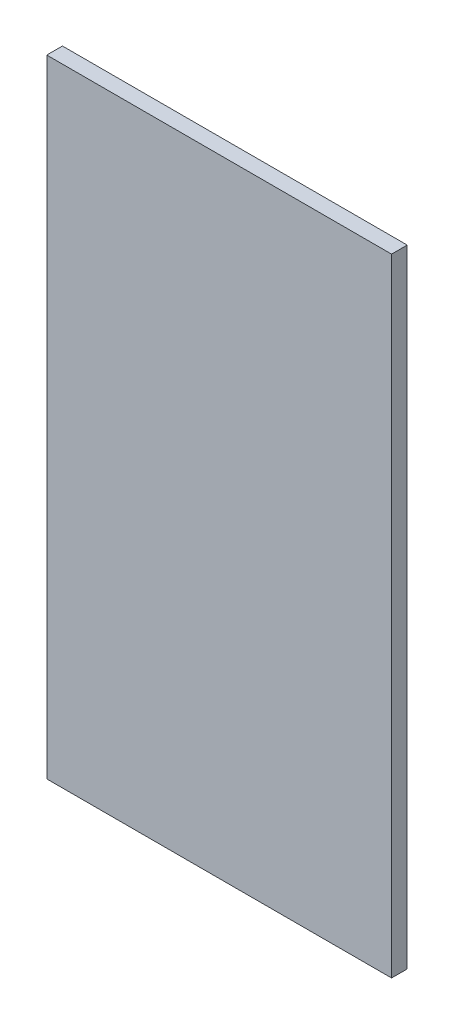
ISO-10303-21;
HEADER;
FILE_DESCRIPTION(('STEP AP214'),'2;1');
FILE_NAME('part.step','',(''),(''),'','','');
FILE_SCHEMA(('AUTOMOTIVE_DESIGN { 1 0 10303 214 1 1 1 1 }'));
ENDSEC;
DATA;
#1=APPLICATION_CONTEXT('core data for automotive mechanical design processes');
#2=APPLICATION_PROTOCOL_DEFINITION('international standard','automotive_design',2000,#1);
#3=PRODUCT_CONTEXT('',#1,'mechanical');
#4=PRODUCT('Part','Part','',(#3));
#5=PRODUCT_RELATED_PRODUCT_CATEGORY('part','',(#4));
#6=PRODUCT_DEFINITION_FORMATION('','',#4);
#7=PRODUCT_DEFINITION_CONTEXT('part definition',#1,'design');
#8=PRODUCT_DEFINITION('design','',#6,#7);
#9=PRODUCT_DEFINITION_SHAPE('','',#8);
#10=(LENGTH_UNIT() NAMED_UNIT(*) SI_UNIT(.MILLI.,.METRE.));
#11=(NAMED_UNIT(*) PLANE_ANGLE_UNIT() SI_UNIT($,.RADIAN.));
#12=(NAMED_UNIT(*) SI_UNIT($,.STERADIAN.) SOLID_ANGLE_UNIT());
#13=UNCERTAINTY_MEASURE_WITH_UNIT(LENGTH_MEASURE(1.E-05),#10,'distance_accuracy_value','');
#14=(GEOMETRIC_REPRESENTATION_CONTEXT(3) GLOBAL_UNCERTAINTY_ASSIGNED_CONTEXT((#13)) GLOBAL_UNIT_ASSIGNED_CONTEXT((#10,
#11,#12)) REPRESENTATION_CONTEXT('',''));
#15=CARTESIAN_POINT('',(0.,0.,0.));
#16=DIRECTION('',(0.,0.,1.));
#17=DIRECTION('',(1.,0.,0.));
#18=AXIS2_PLACEMENT_3D('',#15,#16,#17);
#19=CARTESIAN_POINT('',(314.324999999999,-12.6999999999998,6.35));
#20=DIRECTION('',(1.,0.,0.));
#21=DIRECTION('',(0.,0.,-1.));
#22=AXIS2_PLACEMENT_3D('',#19,#20,#21);
#23=PLANE('',#22);
#24=DIRECTION('',(0.,-1.,0.));
#25=VECTOR('',#24,1.);
#26=CARTESIAN_POINT('',(314.324999999999,-12.6999999999998,0.));
#27=LINE('',#26,#25);
#28=CARTESIAN_POINT('',(314.324999999999,241.3,0.));
#29=VERTEX_POINT('',#28);
#30=CARTESIAN_POINT('',(314.324999999999,-12.6999999999998,0.));
#31=VERTEX_POINT('',#30);
#32=EDGE_CURVE('E100',#29,#31,#27,.T.);
#33=ORIENTED_EDGE('',*,*,#32,.T.);
#34=DIRECTION('',(0.,0.,-1.));
#35=VECTOR('',#34,1.);
#36=CARTESIAN_POINT('',(314.324999999999,-12.6999999999998,6.35));
#37=LINE('',#36,#35);
#38=CARTESIAN_POINT('',(314.324999999999,-12.6999999999998,6.35));
#39=VERTEX_POINT('',#38);
#40=EDGE_CURVE('E11',#39,#31,#37,.T.);
#41=ORIENTED_EDGE('',*,*,#40,.F.);
#42=DIRECTION('',(0.,-1.,0.));
#43=VECTOR('',#42,1.);
#44=CARTESIAN_POINT('',(314.324999999999,-12.6999999999998,6.35));
#45=LINE('',#44,#43);
#46=CARTESIAN_POINT('',(314.324999999999,241.3,6.35));
#47=VERTEX_POINT('',#46);
#48=EDGE_CURVE('E88',#47,#39,#45,.T.);
#49=ORIENTED_EDGE('',*,*,#48,.F.);
#50=DIRECTION('',(0.,0.,-1.));
#51=VECTOR('',#50,1.);
#52=CARTESIAN_POINT('',(314.324999999999,241.3,6.35));
#53=LINE('',#52,#51);
#54=EDGE_CURVE('E96',#47,#29,#53,.T.);
#55=ORIENTED_EDGE('',*,*,#54,.T.);
#56=EDGE_LOOP('',(#33,#41,#49,#55));
#57=FACE_BOUND('',#56,.T.);
#58=ADVANCED_FACE('F37',(#57),#23,.F.);
#59=CARTESIAN_POINT('',(454.025,-12.6999999999998,6.35));
#60=DIRECTION('',(0.,1.,0.));
#61=DIRECTION('',(0.,0.,1.));
#62=AXIS2_PLACEMENT_3D('',#59,#60,#61);
#63=PLANE('',#62);
#64=DIRECTION('',(1.,0.,0.));
#65=VECTOR('',#64,1.);
#66=CARTESIAN_POINT('',(454.025,-12.6999999999998,0.));
#67=LINE('',#66,#65);
#68=CARTESIAN_POINT('',(454.025,-12.6999999999998,0.));
#69=VERTEX_POINT('',#68);
#70=EDGE_CURVE('E92',#31,#69,#67,.T.);
#71=ORIENTED_EDGE('',*,*,#70,.T.);
#72=DIRECTION('',(0.,0.,-1.));
#73=VECTOR('',#72,1.);
#74=CARTESIAN_POINT('',(454.025,-12.6999999999998,6.35));
#75=LINE('',#74,#73);
#76=CARTESIAN_POINT('',(454.025,-12.6999999999998,6.35));
#77=VERTEX_POINT('',#76);
#78=EDGE_CURVE('E45',#77,#69,#75,.T.);
#79=ORIENTED_EDGE('',*,*,#78,.F.);
#80=DIRECTION('',(1.,0.,0.));
#81=VECTOR('',#80,1.);
#82=CARTESIAN_POINT('',(454.025,-12.6999999999998,6.35));
#83=LINE('',#82,#81);
#84=EDGE_CURVE('E83',#39,#77,#83,.T.);
#85=ORIENTED_EDGE('',*,*,#84,.F.);
#86=ORIENTED_EDGE('',*,*,#40,.T.);
#87=EDGE_LOOP('',(#71,#79,#85,#86));
#88=FACE_BOUND('',#87,.T.);
#89=ADVANCED_FACE('F91',(#88),#63,.F.);
#90=CARTESIAN_POINT('',(454.025,-12.6999999999998,6.35));
#91=DIRECTION('',(-1.,0.,0.));
#92=DIRECTION('',(0.,0.,1.));
#93=AXIS2_PLACEMENT_3D('',#90,#91,#92);
#94=PLANE('',#93);
#95=DIRECTION('',(0.,1.,0.));
#96=VECTOR('',#95,1.);
#97=CARTESIAN_POINT('',(454.025,-12.6999999999998,0.));
#98=LINE('',#97,#96);
#99=CARTESIAN_POINT('',(454.025,241.3,0.));
#100=VERTEX_POINT('',#99);
#101=EDGE_CURVE('E70',#69,#100,#98,.T.);
#102=ORIENTED_EDGE('',*,*,#101,.T.);
#103=DIRECTION('',(0.,0.,-1.));
#104=VECTOR('',#103,1.);
#105=CARTESIAN_POINT('',(454.025,241.3,6.35));
#106=LINE('',#105,#104);
#107=CARTESIAN_POINT('',(454.025,241.3,6.35));
#108=VERTEX_POINT('',#107);
#109=EDGE_CURVE('E93',#108,#100,#106,.T.);
#110=ORIENTED_EDGE('',*,*,#109,.F.);
#111=DIRECTION('',(0.,1.,0.));
#112=VECTOR('',#111,1.);
#113=CARTESIAN_POINT('',(454.025,-12.6999999999998,6.35));
#114=LINE('',#113,#112);
#115=EDGE_CURVE('E86',#77,#108,#114,.T.);
#116=ORIENTED_EDGE('',*,*,#115,.F.);
#117=ORIENTED_EDGE('',*,*,#78,.T.);
#118=EDGE_LOOP('',(#102,#110,#116,#117));
#119=FACE_BOUND('',#118,.T.);
#120=ADVANCED_FACE('F94',(#119),#94,.F.);
#121=CARTESIAN_POINT('',(454.025,241.3,6.35));
#122=DIRECTION('',(0.,-1.,0.));
#123=DIRECTION('',(0.,0.,-1.));
#124=AXIS2_PLACEMENT_3D('',#121,#122,#123);
#125=PLANE('',#124);
#126=DIRECTION('',(-1.,0.,0.));
#127=VECTOR('',#126,1.);
#128=CARTESIAN_POINT('',(454.025,241.3,0.));
#129=LINE('',#128,#127);
#130=EDGE_CURVE('E76',#100,#29,#129,.T.);
#131=ORIENTED_EDGE('',*,*,#130,.T.);
#132=ORIENTED_EDGE('',*,*,#54,.F.);
#133=DIRECTION('',(-1.,0.,0.));
#134=VECTOR('',#133,1.);
#135=CARTESIAN_POINT('',(454.025,241.3,6.35));
#136=LINE('',#135,#134);
#137=EDGE_CURVE('E53',#108,#47,#136,.T.);
#138=ORIENTED_EDGE('',*,*,#137,.F.);
#139=ORIENTED_EDGE('',*,*,#109,.T.);
#140=EDGE_LOOP('',(#131,#132,#138,#139));
#141=FACE_BOUND('',#140,.T.);
#142=ADVANCED_FACE('F107',(#141),#125,.F.);
#143=CARTESIAN_POINT('',(0.,0.,6.35));
#144=DIRECTION('',(0.,0.,1.));
#145=DIRECTION('',(1.,0.,0.));
#146=AXIS2_PLACEMENT_3D('',#143,#144,#145);
#147=PLANE('',#146);
#148=ORIENTED_EDGE('',*,*,#48,.T.);
#149=ORIENTED_EDGE('',*,*,#84,.T.);
#150=ORIENTED_EDGE('',*,*,#115,.T.);
#151=ORIENTED_EDGE('',*,*,#137,.T.);
#152=EDGE_LOOP('',(#148,#149,#150,#151));
#153=FACE_BOUND('',#152,.T.);
#154=ADVANCED_FACE('F84',(#153),#147,.T.);
#155=CARTESIAN_POINT('',(0.,0.,0.));
#156=DIRECTION('',(0.,0.,1.));
#157=DIRECTION('',(1.,0.,0.));
#158=AXIS2_PLACEMENT_3D('',#155,#156,#157);
#159=PLANE('',#158);
#160=ORIENTED_EDGE('',*,*,#32,.F.);
#161=ORIENTED_EDGE('',*,*,#130,.F.);
#162=ORIENTED_EDGE('',*,*,#101,.F.);
#163=ORIENTED_EDGE('',*,*,#70,.F.);
#164=EDGE_LOOP('',(#160,#161,#162,#163));
#165=FACE_BOUND('',#164,.T.);
#166=ADVANCED_FACE('F110',(#165),#159,.F.);
#167=CLOSED_SHELL('',(#58,#89,#120,#142,#154,#166));
#168=MANIFOLD_SOLID_BREP('B2',#167);
#169=ADVANCED_BREP_SHAPE_REPRESENTATION('',(#18,#168),#14);
#170=SHAPE_DEFINITION_REPRESENTATION(#9,#169);
ENDSEC;
END-ISO-10303-21;
